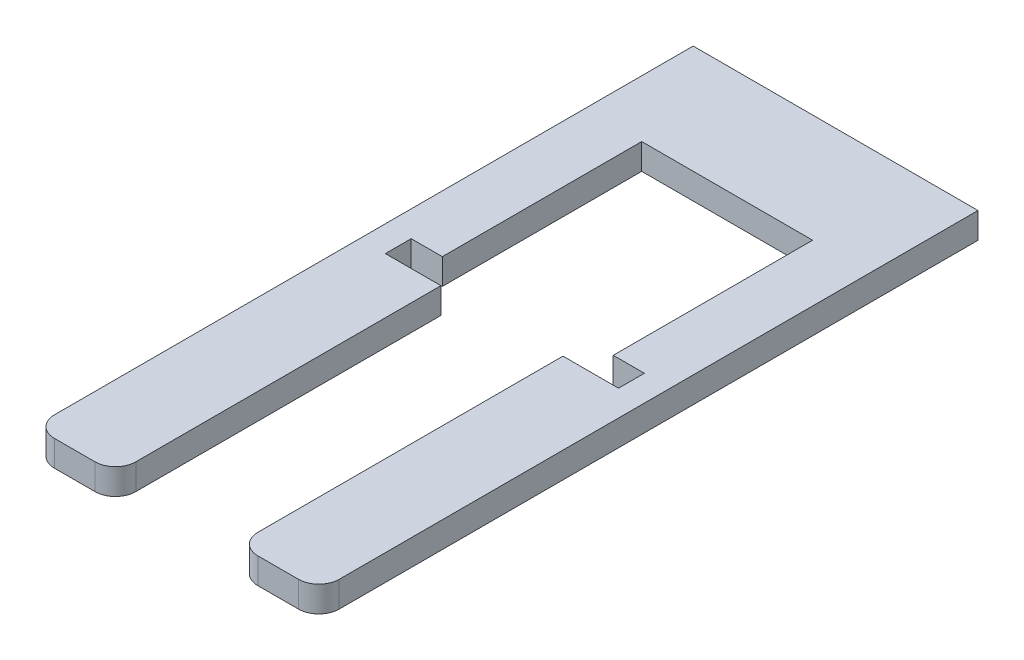
ISO-10303-21;
HEADER;
FILE_DESCRIPTION(('STEP AP214'),'2;1');
FILE_NAME('part.step','',(''),(''),'','','');
FILE_SCHEMA(('AUTOMOTIVE_DESIGN { 1 0 10303 214 1 1 1 1 }'));
ENDSEC;
DATA;
#1=APPLICATION_CONTEXT('core data for automotive mechanical design processes');
#2=APPLICATION_PROTOCOL_DEFINITION('international standard','automotive_design',2000,#1);
#3=PRODUCT_CONTEXT('',#1,'mechanical');
#4=PRODUCT('Part','Part','',(#3));
#5=PRODUCT_RELATED_PRODUCT_CATEGORY('part','',(#4));
#6=PRODUCT_DEFINITION_FORMATION('','',#4);
#7=PRODUCT_DEFINITION_CONTEXT('part definition',#1,'design');
#8=PRODUCT_DEFINITION('design','',#6,#7);
#9=PRODUCT_DEFINITION_SHAPE('','',#8);
#10=(LENGTH_UNIT() NAMED_UNIT(*) SI_UNIT(.MILLI.,.METRE.));
#11=(NAMED_UNIT(*) PLANE_ANGLE_UNIT() SI_UNIT($,.RADIAN.));
#12=(NAMED_UNIT(*) SI_UNIT($,.STERADIAN.) SOLID_ANGLE_UNIT());
#13=UNCERTAINTY_MEASURE_WITH_UNIT(LENGTH_MEASURE(1.E-05),#10,'distance_accuracy_value','');
#14=(GEOMETRIC_REPRESENTATION_CONTEXT(3) GLOBAL_UNCERTAINTY_ASSIGNED_CONTEXT((#13)) GLOBAL_UNIT_ASSIGNED_CONTEXT((#10,
#11,#12)) REPRESENTATION_CONTEXT('',''));
#15=CARTESIAN_POINT('',(0.,0.,0.));
#16=DIRECTION('',(0.,0.,1.));
#17=DIRECTION('',(1.,0.,0.));
#18=AXIS2_PLACEMENT_3D('',#15,#16,#17);
#19=CARTESIAN_POINT('',(0.,3.175,200.));
#20=DIRECTION('',(0.,0.,-1.));
#21=DIRECTION('',(-1.,0.,0.));
#22=AXIS2_PLACEMENT_3D('',#19,#20,#21);
#23=PLANE('',#22);
#24=DIRECTION('',(1.,0.,0.));
#25=VECTOR('',#24,1.);
#26=CARTESIAN_POINT('',(0.,-3.175,200.));
#27=LINE('',#26,#25);
#28=CARTESIAN_POINT('',(-30.,-3.175,200.));
#29=VERTEX_POINT('',#28);
#30=CARTESIAN_POINT('',(-20.,-3.175,200.));
#31=VERTEX_POINT('',#30);
#32=EDGE_CURVE('E287',#29,#31,#27,.T.);
#33=ORIENTED_EDGE('',*,*,#32,.T.);
#34=DIRECTION('',(0.,1.,0.));
#35=VECTOR('',#34,1.);
#36=CARTESIAN_POINT('',(-20.,3.175,200.));
#37=LINE('',#36,#35);
#38=CARTESIAN_POINT('',(-20.,3.175,200.));
#39=VERTEX_POINT('',#38);
#40=EDGE_CURVE('E314',#31,#39,#37,.T.);
#41=ORIENTED_EDGE('',*,*,#40,.T.);
#42=DIRECTION('',(1.,0.,0.));
#43=VECTOR('',#42,1.);
#44=CARTESIAN_POINT('',(0.,3.175,200.));
#45=LINE('',#44,#43);
#46=CARTESIAN_POINT('',(-30.,3.175,200.));
#47=VERTEX_POINT('',#46);
#48=EDGE_CURVE('E279',#47,#39,#45,.T.);
#49=ORIENTED_EDGE('',*,*,#48,.F.);
#50=DIRECTION('',(0.,-1.,0.));
#51=VECTOR('',#50,1.);
#52=CARTESIAN_POINT('',(-30.,3.175,200.));
#53=LINE('',#52,#51);
#54=EDGE_CURVE('E311',#47,#29,#53,.T.);
#55=ORIENTED_EDGE('',*,*,#54,.T.);
#56=EDGE_LOOP('',(#33,#41,#49,#55));
#57=FACE_BOUND('',#56,.T.);
#58=ADVANCED_FACE('F37',(#57),#23,.F.);
#59=CARTESIAN_POINT('',(-35.,3.175,0.));
#60=DIRECTION('',(1.,0.,0.));
#61=DIRECTION('',(0.,0.,-1.));
#62=AXIS2_PLACEMENT_3D('',#59,#60,#61);
#63=PLANE('',#62);
#64=DIRECTION('',(0.,0.,1.));
#65=VECTOR('',#64,1.);
#66=CARTESIAN_POINT('',(-35.,-3.175,0.));
#67=LINE('',#66,#65);
#68=CARTESIAN_POINT('',(-35.,-3.175,38.));
#69=VERTEX_POINT('',#68);
#70=CARTESIAN_POINT('',(-35.,-3.175,195.));
#71=VERTEX_POINT('',#70);
#72=EDGE_CURVE('E271',#69,#71,#67,.T.);
#73=ORIENTED_EDGE('',*,*,#72,.T.);
#74=DIRECTION('',(0.,-1.,0.));
#75=VECTOR('',#74,1.);
#76=CARTESIAN_POINT('',(-35.,3.175,195.));
#77=LINE('',#76,#75);
#78=CARTESIAN_POINT('',(-35.,3.175,195.));
#79=VERTEX_POINT('',#78);
#80=EDGE_CURVE('E11',#71,#79,#77,.F.);
#81=ORIENTED_EDGE('',*,*,#80,.T.);
#82=DIRECTION('',(0.,0.,1.));
#83=VECTOR('',#82,1.);
#84=CARTESIAN_POINT('',(-35.,3.175,0.));
#85=LINE('',#84,#83);
#86=CARTESIAN_POINT('',(-35.,3.175,38.));
#87=VERTEX_POINT('',#86);
#88=EDGE_CURVE('E274',#87,#79,#85,.T.);
#89=ORIENTED_EDGE('',*,*,#88,.F.);
#90=DIRECTION('',(0.,1.,0.));
#91=VECTOR('',#90,1.);
#92=CARTESIAN_POINT('',(-35.,-3.175,38.));
#93=LINE('',#92,#91);
#94=EDGE_CURVE('E269',#69,#87,#93,.T.);
#95=ORIENTED_EDGE('',*,*,#94,.F.);
#96=EDGE_LOOP('',(#73,#81,#89,#95));
#97=FACE_BOUND('',#96,.T.);
#98=ADVANCED_FACE('F332',(#97),#63,.F.);
#99=CARTESIAN_POINT('',(35.,3.175,0.));
#100=DIRECTION('',(-1.,0.,0.));
#101=DIRECTION('',(0.,0.,1.));
#102=AXIS2_PLACEMENT_3D('',#99,#100,#101);
#103=PLANE('',#102);
#104=DIRECTION('',(0.,0.,-1.));
#105=VECTOR('',#104,1.);
#106=CARTESIAN_POINT('',(35.,3.175,0.));
#107=LINE('',#106,#105);
#108=CARTESIAN_POINT('',(35.,3.175,195.));
#109=VERTEX_POINT('',#108);
#110=CARTESIAN_POINT('',(35.,3.175,38.));
#111=VERTEX_POINT('',#110);
#112=EDGE_CURVE('E282',#109,#111,#107,.T.);
#113=ORIENTED_EDGE('',*,*,#112,.F.);
#114=DIRECTION('',(0.,-1.,0.));
#115=VECTOR('',#114,1.);
#116=CARTESIAN_POINT('',(35.,3.175,195.));
#117=LINE('',#116,#115);
#118=CARTESIAN_POINT('',(35.,-3.175,195.));
#119=VERTEX_POINT('',#118);
#120=EDGE_CURVE('E45',#109,#119,#117,.T.);
#121=ORIENTED_EDGE('',*,*,#120,.T.);
#122=DIRECTION('',(0.,0.,-1.));
#123=VECTOR('',#122,1.);
#124=CARTESIAN_POINT('',(35.,-3.175,0.));
#125=LINE('',#124,#123);
#126=CARTESIAN_POINT('',(35.,-3.175,38.));
#127=VERTEX_POINT('',#126);
#128=EDGE_CURVE('E278',#119,#127,#125,.T.);
#129=ORIENTED_EDGE('',*,*,#128,.T.);
#130=DIRECTION('',(0.,1.,0.));
#131=VECTOR('',#130,1.);
#132=CARTESIAN_POINT('',(35.,-3.175,38.));
#133=LINE('',#132,#131);
#134=EDGE_CURVE('E266',#127,#111,#133,.T.);
#135=ORIENTED_EDGE('',*,*,#134,.T.);
#136=EDGE_LOOP('',(#113,#121,#129,#135));
#137=FACE_BOUND('',#136,.T.);
#138=ADVANCED_FACE('F321',(#137),#103,.F.);
#139=CARTESIAN_POINT('',(0.,3.175,0.));
#140=DIRECTION('',(0.,1.,0.));
#141=DIRECTION('',(0.,0.,1.));
#142=AXIS2_PLACEMENT_3D('',#139,#140,#141);
#143=PLANE('',#142);
#144=DIRECTION('',(0.,0.,-1.));
#145=VECTOR('',#144,1.);
#146=CARTESIAN_POINT('',(15.,3.175,0.));
#147=LINE('',#146,#145);
#148=CARTESIAN_POINT('',(15.,3.175,195.));
#149=VERTEX_POINT('',#148);
#150=CARTESIAN_POINT('',(15.,3.175,120.));
#151=VERTEX_POINT('',#150);
#152=EDGE_CURVE('E234',#149,#151,#147,.T.);
#153=ORIENTED_EDGE('',*,*,#152,.F.);
#154=CARTESIAN_POINT('',(20.,3.175,195.));
#155=DIRECTION('',(0.,1.,0.));
#156=DIRECTION('',(0.,0.,1.));
#157=AXIS2_PLACEMENT_3D('',#154,#155,#156);
#158=CIRCLE('',#157,5.);
#159=CARTESIAN_POINT('',(20.,3.175,200.));
#160=VERTEX_POINT('',#159);
#161=EDGE_CURVE('E299',#149,#160,#158,.T.);
#162=ORIENTED_EDGE('',*,*,#161,.T.);
#163=CARTESIAN_POINT('',(30.,3.175,200.));
#164=VERTEX_POINT('',#163);
#165=EDGE_CURVE('E277',#160,#164,#45,.T.);
#166=ORIENTED_EDGE('',*,*,#165,.T.);
#167=CARTESIAN_POINT('',(30.,3.175,195.));
#168=DIRECTION('',(0.,1.,0.));
#169=DIRECTION('',(0.,0.,1.));
#170=AXIS2_PLACEMENT_3D('',#167,#168,#169);
#171=CIRCLE('',#170,5.);
#172=EDGE_CURVE('E295',#164,#109,#171,.T.);
#173=ORIENTED_EDGE('',*,*,#172,.T.);
#174=ORIENTED_EDGE('',*,*,#112,.T.);
#175=DIRECTION('',(-1.,0.,0.));
#176=VECTOR('',#175,1.);
#177=CARTESIAN_POINT('',(0.,3.175,38.));
#178=LINE('',#177,#176);
#179=EDGE_CURVE('E246',#111,#87,#178,.T.);
#180=ORIENTED_EDGE('',*,*,#179,.T.);
#181=ORIENTED_EDGE('',*,*,#88,.T.);
#182=CARTESIAN_POINT('',(-30.,3.175,195.));
#183=DIRECTION('',(0.,1.,0.));
#184=DIRECTION('',(0.,0.,1.));
#185=AXIS2_PLACEMENT_3D('',#182,#183,#184);
#186=CIRCLE('',#185,5.);
#187=EDGE_CURVE('E293',#79,#47,#186,.T.);
#188=ORIENTED_EDGE('',*,*,#187,.T.);
#189=ORIENTED_EDGE('',*,*,#48,.T.);
#190=CARTESIAN_POINT('',(-20.,3.175,195.));
#191=DIRECTION('',(0.,1.,0.));
#192=DIRECTION('',(0.,0.,1.));
#193=AXIS2_PLACEMENT_3D('',#190,#191,#192);
#194=CIRCLE('',#193,5.);
#195=CARTESIAN_POINT('',(-15.,3.175,195.));
#196=VERTEX_POINT('',#195);
#197=EDGE_CURVE('E297',#39,#196,#194,.T.);
#198=ORIENTED_EDGE('',*,*,#197,.T.);
#199=DIRECTION('',(0.,0.,-1.));
#200=VECTOR('',#199,1.);
#201=CARTESIAN_POINT('',(-15.,3.175,0.));
#202=LINE('',#201,#200);
#203=CARTESIAN_POINT('',(-15.,3.175,120.));
#204=VERTEX_POINT('',#203);
#205=EDGE_CURVE('E231',#196,#204,#202,.T.);
#206=ORIENTED_EDGE('',*,*,#205,.T.);
#207=DIRECTION('',(-1.,0.,0.));
#208=VECTOR('',#207,1.);
#209=CARTESIAN_POINT('',(0.,3.175,120.));
#210=LINE('',#209,#208);
#211=CARTESIAN_POINT('',(-28.65,3.175,120.));
#212=VERTEX_POINT('',#211);
#213=EDGE_CURVE('E228',#204,#212,#210,.T.);
#214=ORIENTED_EDGE('',*,*,#213,.T.);
#215=DIRECTION('',(0.,0.,-1.));
#216=VECTOR('',#215,1.);
#217=CARTESIAN_POINT('',(-28.65,3.175,0.));
#218=LINE('',#217,#216);
#219=CARTESIAN_POINT('',(-28.65,3.175,113.65));
#220=VERTEX_POINT('',#219);
#221=EDGE_CURVE('E225',#212,#220,#218,.T.);
#222=ORIENTED_EDGE('',*,*,#221,.T.);
#223=DIRECTION('',(-1.,0.,0.));
#224=VECTOR('',#223,1.);
#225=CARTESIAN_POINT('',(0.,3.175,113.65));
#226=LINE('',#225,#224);
#227=CARTESIAN_POINT('',(-21.,3.175,113.65));
#228=VERTEX_POINT('',#227);
#229=EDGE_CURVE('E223',#228,#220,#226,.T.);
#230=ORIENTED_EDGE('',*,*,#229,.F.);
#231=DIRECTION('',(0.,0.,-1.));
#232=VECTOR('',#231,1.);
#233=CARTESIAN_POINT('',(-21.,3.175,0.));
#234=LINE('',#233,#232);
#235=CARTESIAN_POINT('',(-21.,3.175,64.65));
#236=VERTEX_POINT('',#235);
#237=EDGE_CURVE('E181',#228,#236,#234,.T.);
#238=ORIENTED_EDGE('',*,*,#237,.T.);
#239=DIRECTION('',(-1.,0.,0.));
#240=VECTOR('',#239,1.);
#241=CARTESIAN_POINT('',(0.,3.175,64.65));
#242=LINE('',#241,#240);
#243=CARTESIAN_POINT('',(21.,3.175,64.65));
#244=VERTEX_POINT('',#243);
#245=EDGE_CURVE('E200',#244,#236,#242,.T.);
#246=ORIENTED_EDGE('',*,*,#245,.F.);
#247=DIRECTION('',(0.,0.,-1.));
#248=VECTOR('',#247,1.);
#249=CARTESIAN_POINT('',(21.,3.175,0.));
#250=LINE('',#249,#248);
#251=CARTESIAN_POINT('',(21.,3.175,113.65));
#252=VERTEX_POINT('',#251);
#253=EDGE_CURVE('E203',#252,#244,#250,.T.);
#254=ORIENTED_EDGE('',*,*,#253,.F.);
#255=DIRECTION('',(1.,0.,0.));
#256=VECTOR('',#255,1.);
#257=CARTESIAN_POINT('',(0.,3.175,113.65));
#258=LINE('',#257,#256);
#259=CARTESIAN_POINT('',(28.65,3.175,113.65));
#260=VERTEX_POINT('',#259);
#261=EDGE_CURVE('E239',#252,#260,#258,.T.);
#262=ORIENTED_EDGE('',*,*,#261,.T.);
#263=DIRECTION('',(0.,0.,-1.));
#264=VECTOR('',#263,1.);
#265=CARTESIAN_POINT('',(28.65,3.175,0.));
#266=LINE('',#265,#264);
#267=CARTESIAN_POINT('',(28.65,3.175,120.));
#268=VERTEX_POINT('',#267);
#269=EDGE_CURVE('E236',#268,#260,#266,.T.);
#270=ORIENTED_EDGE('',*,*,#269,.F.);
#271=EDGE_CURVE('E232',#268,#151,#210,.T.);
#272=ORIENTED_EDGE('',*,*,#271,.T.);
#273=EDGE_LOOP('',(#153,#162,#166,#173,#174,#180,#181,#188,#189,#198,#206,#214,#222,#230,#238,
#246,#254,#262,#270,#272));
#274=FACE_BOUND('',#273,.T.);
#275=ADVANCED_FACE('F337',(#274),#143,.T.);
#276=CARTESIAN_POINT('',(0.,-3.175,0.));
#277=DIRECTION('',(0.,1.,0.));
#278=DIRECTION('',(0.,0.,1.));
#279=AXIS2_PLACEMENT_3D('',#276,#277,#278);
#280=PLANE('',#279);
#281=CARTESIAN_POINT('',(20.,-3.175,200.));
#282=VERTEX_POINT('',#281);
#283=CARTESIAN_POINT('',(30.,-3.175,200.));
#284=VERTEX_POINT('',#283);
#285=EDGE_CURVE('E286',#282,#284,#27,.T.);
#286=ORIENTED_EDGE('',*,*,#285,.F.);
#287=CARTESIAN_POINT('',(20.,-3.175,195.));
#288=DIRECTION('',(0.,1.,0.));
#289=DIRECTION('',(0.,0.,1.));
#290=AXIS2_PLACEMENT_3D('',#287,#288,#289);
#291=CIRCLE('',#290,5.);
#292=CARTESIAN_POINT('',(15.,-3.175,195.));
#293=VERTEX_POINT('',#292);
#294=EDGE_CURVE('E309',#282,#293,#291,.F.);
#295=ORIENTED_EDGE('',*,*,#294,.T.);
#296=DIRECTION('',(0.,0.,-1.));
#297=VECTOR('',#296,1.);
#298=CARTESIAN_POINT('',(15.,-3.175,0.));
#299=LINE('',#298,#297);
#300=CARTESIAN_POINT('',(15.,-3.175,120.));
#301=VERTEX_POINT('',#300);
#302=EDGE_CURVE('E212',#293,#301,#299,.T.);
#303=ORIENTED_EDGE('',*,*,#302,.T.);
#304=DIRECTION('',(-1.,0.,0.));
#305=VECTOR('',#304,1.);
#306=CARTESIAN_POINT('',(0.,-3.175,120.));
#307=LINE('',#306,#305);
#308=CARTESIAN_POINT('',(28.65,-3.175,120.));
#309=VERTEX_POINT('',#308);
#310=EDGE_CURVE('E210',#309,#301,#307,.T.);
#311=ORIENTED_EDGE('',*,*,#310,.F.);
#312=DIRECTION('',(0.,0.,-1.));
#313=VECTOR('',#312,1.);
#314=CARTESIAN_POINT('',(28.65,-3.175,0.));
#315=LINE('',#314,#313);
#316=CARTESIAN_POINT('',(28.65,-3.175,113.65));
#317=VERTEX_POINT('',#316);
#318=EDGE_CURVE('E214',#309,#317,#315,.T.);
#319=ORIENTED_EDGE('',*,*,#318,.T.);
#320=DIRECTION('',(1.,0.,0.));
#321=VECTOR('',#320,1.);
#322=CARTESIAN_POINT('',(0.,-3.175,113.65));
#323=LINE('',#322,#321);
#324=CARTESIAN_POINT('',(21.,-3.175,113.65));
#325=VERTEX_POINT('',#324);
#326=EDGE_CURVE('E217',#325,#317,#323,.T.);
#327=ORIENTED_EDGE('',*,*,#326,.F.);
#328=DIRECTION('',(0.,0.,-1.));
#329=VECTOR('',#328,1.);
#330=CARTESIAN_POINT('',(21.,-3.175,0.));
#331=LINE('',#330,#329);
#332=CARTESIAN_POINT('',(21.,-3.175,64.65));
#333=VERTEX_POINT('',#332);
#334=EDGE_CURVE('E219',#325,#333,#331,.T.);
#335=ORIENTED_EDGE('',*,*,#334,.T.);
#336=DIRECTION('',(-1.,0.,0.));
#337=VECTOR('',#336,1.);
#338=CARTESIAN_POINT('',(0.,-3.175,64.65));
#339=LINE('',#338,#337);
#340=CARTESIAN_POINT('',(-21.,-3.175,64.65));
#341=VERTEX_POINT('',#340);
#342=EDGE_CURVE('E186',#333,#341,#339,.T.);
#343=ORIENTED_EDGE('',*,*,#342,.T.);
#344=DIRECTION('',(0.,0.,-1.));
#345=VECTOR('',#344,1.);
#346=CARTESIAN_POINT('',(-21.,-3.175,0.));
#347=LINE('',#346,#345);
#348=CARTESIAN_POINT('',(-21.,-3.175,113.65));
#349=VERTEX_POINT('',#348);
#350=EDGE_CURVE('E178',#349,#341,#347,.T.);
#351=ORIENTED_EDGE('',*,*,#350,.F.);
#352=DIRECTION('',(-1.,0.,0.));
#353=VECTOR('',#352,1.);
#354=CARTESIAN_POINT('',(0.,-3.175,113.65));
#355=LINE('',#354,#353);
#356=CARTESIAN_POINT('',(-28.65,-3.175,113.65));
#357=VERTEX_POINT('',#356);
#358=EDGE_CURVE('E190',#349,#357,#355,.T.);
#359=ORIENTED_EDGE('',*,*,#358,.T.);
#360=DIRECTION('',(0.,0.,-1.));
#361=VECTOR('',#360,1.);
#362=CARTESIAN_POINT('',(-28.65,-3.175,0.));
#363=LINE('',#362,#361);
#364=CARTESIAN_POINT('',(-28.65,-3.175,120.));
#365=VERTEX_POINT('',#364);
#366=EDGE_CURVE('E193',#365,#357,#363,.T.);
#367=ORIENTED_EDGE('',*,*,#366,.F.);
#368=CARTESIAN_POINT('',(-15.,-3.175,120.));
#369=VERTEX_POINT('',#368);
#370=EDGE_CURVE('E207',#369,#365,#307,.T.);
#371=ORIENTED_EDGE('',*,*,#370,.F.);
#372=DIRECTION('',(0.,0.,-1.));
#373=VECTOR('',#372,1.);
#374=CARTESIAN_POINT('',(-15.,-3.175,0.));
#375=LINE('',#374,#373);
#376=CARTESIAN_POINT('',(-15.,-3.175,195.));
#377=VERTEX_POINT('',#376);
#378=EDGE_CURVE('E209',#377,#369,#375,.T.);
#379=ORIENTED_EDGE('',*,*,#378,.F.);
#380=CARTESIAN_POINT('',(-20.,-3.175,195.));
#381=DIRECTION('',(0.,1.,0.));
#382=DIRECTION('',(0.,0.,1.));
#383=AXIS2_PLACEMENT_3D('',#380,#381,#382);
#384=CIRCLE('',#383,5.);
#385=EDGE_CURVE('E307',#377,#31,#384,.F.);
#386=ORIENTED_EDGE('',*,*,#385,.T.);
#387=ORIENTED_EDGE('',*,*,#32,.F.);
#388=CARTESIAN_POINT('',(-30.,-3.175,195.));
#389=DIRECTION('',(0.,1.,0.));
#390=DIRECTION('',(0.,0.,1.));
#391=AXIS2_PLACEMENT_3D('',#388,#389,#390);
#392=CIRCLE('',#391,5.);
#393=EDGE_CURVE('E60',#29,#71,#392,.F.);
#394=ORIENTED_EDGE('',*,*,#393,.T.);
#395=ORIENTED_EDGE('',*,*,#72,.F.);
#396=DIRECTION('',(-1.,0.,0.));
#397=VECTOR('',#396,1.);
#398=CARTESIAN_POINT('',(0.,-3.175,38.));
#399=LINE('',#398,#397);
#400=EDGE_CURVE('E264',#127,#69,#399,.T.);
#401=ORIENTED_EDGE('',*,*,#400,.F.);
#402=ORIENTED_EDGE('',*,*,#128,.F.);
#403=CARTESIAN_POINT('',(30.,-3.175,195.));
#404=DIRECTION('',(0.,1.,0.));
#405=DIRECTION('',(0.,0.,1.));
#406=AXIS2_PLACEMENT_3D('',#403,#404,#405);
#407=CIRCLE('',#406,5.);
#408=EDGE_CURVE('E52',#119,#284,#407,.F.);
#409=ORIENTED_EDGE('',*,*,#408,.T.);
#410=EDGE_LOOP('',(#286,#295,#303,#311,#319,#327,#335,#343,#351,#359,#367,#371,#379,#386,#387,
#394,#395,#401,#402,#409));
#411=FACE_BOUND('',#410,.T.);
#412=ADVANCED_FACE('F197',(#411),#280,.F.);
#413=ORIENTED_EDGE('',*,*,#165,.F.);
#414=DIRECTION('',(0.,1.,0.));
#415=VECTOR('',#414,1.);
#416=CARTESIAN_POINT('',(20.,3.175,200.));
#417=LINE('',#416,#415);
#418=EDGE_CURVE('E303',#160,#282,#417,.F.);
#419=ORIENTED_EDGE('',*,*,#418,.T.);
#420=ORIENTED_EDGE('',*,*,#285,.T.);
#421=DIRECTION('',(0.,-1.,0.));
#422=VECTOR('',#421,1.);
#423=CARTESIAN_POINT('',(30.,3.175,200.));
#424=LINE('',#423,#422);
#425=EDGE_CURVE('E301',#284,#164,#424,.F.);
#426=ORIENTED_EDGE('',*,*,#425,.T.);
#427=EDGE_LOOP('',(#413,#419,#420,#426));
#428=FACE_BOUND('',#427,.T.);
#429=ADVANCED_FACE('F373',(#428),#23,.F.);
#430=CARTESIAN_POINT('',(0.,-3.175,38.));
#431=DIRECTION('',(0.,0.,-1.));
#432=DIRECTION('',(-1.,0.,0.));
#433=AXIS2_PLACEMENT_3D('',#430,#431,#432);
#434=PLANE('',#433);
#435=ORIENTED_EDGE('',*,*,#179,.F.);
#436=ORIENTED_EDGE('',*,*,#134,.F.);
#437=ORIENTED_EDGE('',*,*,#400,.T.);
#438=ORIENTED_EDGE('',*,*,#94,.T.);
#439=EDGE_LOOP('',(#435,#436,#437,#438));
#440=FACE_BOUND('',#439,.T.);
#441=ADVANCED_FACE('F329',(#440),#434,.T.);
#442=CARTESIAN_POINT('',(-21.,-3.175,0.));
#443=DIRECTION('',(1.,0.,0.));
#444=DIRECTION('',(0.,0.,-1.));
#445=AXIS2_PLACEMENT_3D('',#442,#443,#444);
#446=PLANE('',#445);
#447=ORIENTED_EDGE('',*,*,#237,.F.);
#448=DIRECTION('',(0.,1.,0.));
#449=VECTOR('',#448,1.);
#450=CARTESIAN_POINT('',(-21.,-3.175,113.65));
#451=LINE('',#450,#449);
#452=EDGE_CURVE('E174',#349,#228,#451,.T.);
#453=ORIENTED_EDGE('',*,*,#452,.F.);
#454=ORIENTED_EDGE('',*,*,#350,.T.);
#455=DIRECTION('',(0.,1.,0.));
#456=VECTOR('',#455,1.);
#457=CARTESIAN_POINT('',(-21.,-3.175,64.65));
#458=LINE('',#457,#456);
#459=EDGE_CURVE('E244',#341,#236,#458,.T.);
#460=ORIENTED_EDGE('',*,*,#459,.T.);
#461=EDGE_LOOP('',(#447,#453,#454,#460));
#462=FACE_BOUND('',#461,.T.);
#463=ADVANCED_FACE('F176',(#462),#446,.T.);
#464=CARTESIAN_POINT('',(0.,-3.175,64.65));
#465=DIRECTION('',(0.,0.,-1.));
#466=DIRECTION('',(-1.,0.,0.));
#467=AXIS2_PLACEMENT_3D('',#464,#465,#466);
#468=PLANE('',#467);
#469=ORIENTED_EDGE('',*,*,#245,.T.);
#470=ORIENTED_EDGE('',*,*,#459,.F.);
#471=ORIENTED_EDGE('',*,*,#342,.F.);
#472=DIRECTION('',(0.,1.,0.));
#473=VECTOR('',#472,1.);
#474=CARTESIAN_POINT('',(21.,-3.175,64.65));
#475=LINE('',#474,#473);
#476=EDGE_CURVE('E247',#333,#244,#475,.T.);
#477=ORIENTED_EDGE('',*,*,#476,.T.);
#478=EDGE_LOOP('',(#469,#470,#471,#477));
#479=FACE_BOUND('',#478,.T.);
#480=ADVANCED_FACE('F417',(#479),#468,.F.);
#481=CARTESIAN_POINT('',(21.,-3.175,0.));
#482=DIRECTION('',(1.,0.,0.));
#483=DIRECTION('',(0.,0.,-1.));
#484=AXIS2_PLACEMENT_3D('',#481,#482,#483);
#485=PLANE('',#484);
#486=ORIENTED_EDGE('',*,*,#253,.T.);
#487=ORIENTED_EDGE('',*,*,#476,.F.);
#488=ORIENTED_EDGE('',*,*,#334,.F.);
#489=DIRECTION('',(0.,1.,0.));
#490=VECTOR('',#489,1.);
#491=CARTESIAN_POINT('',(21.,-3.175,113.65));
#492=LINE('',#491,#490);
#493=EDGE_CURVE('E249',#325,#252,#492,.T.);
#494=ORIENTED_EDGE('',*,*,#493,.T.);
#495=EDGE_LOOP('',(#486,#487,#488,#494));
#496=FACE_BOUND('',#495,.T.);
#497=ADVANCED_FACE('F414',(#496),#485,.F.);
#498=CARTESIAN_POINT('',(0.,-3.175,113.65));
#499=DIRECTION('',(0.,0.,1.));
#500=DIRECTION('',(1.,0.,0.));
#501=AXIS2_PLACEMENT_3D('',#498,#499,#500);
#502=PLANE('',#501);
#503=ORIENTED_EDGE('',*,*,#261,.F.);
#504=ORIENTED_EDGE('',*,*,#493,.F.);
#505=ORIENTED_EDGE('',*,*,#326,.T.);
#506=DIRECTION('',(0.,1.,0.));
#507=VECTOR('',#506,1.);
#508=CARTESIAN_POINT('',(28.65,-3.175,113.65));
#509=LINE('',#508,#507);
#510=EDGE_CURVE('E251',#317,#260,#509,.T.);
#511=ORIENTED_EDGE('',*,*,#510,.T.);
#512=EDGE_LOOP('',(#503,#504,#505,#511));
#513=FACE_BOUND('',#512,.T.);
#514=ADVANCED_FACE('F412',(#513),#502,.T.);
#515=CARTESIAN_POINT('',(28.65,-3.175,0.));
#516=DIRECTION('',(1.,0.,0.));
#517=DIRECTION('',(0.,0.,-1.));
#518=AXIS2_PLACEMENT_3D('',#515,#516,#517);
#519=PLANE('',#518);
#520=ORIENTED_EDGE('',*,*,#269,.T.);
#521=ORIENTED_EDGE('',*,*,#510,.F.);
#522=ORIENTED_EDGE('',*,*,#318,.F.);
#523=DIRECTION('',(0.,1.,0.));
#524=VECTOR('',#523,1.);
#525=CARTESIAN_POINT('',(28.65,-3.175,120.));
#526=LINE('',#525,#524);
#527=EDGE_CURVE('E253',#309,#268,#526,.T.);
#528=ORIENTED_EDGE('',*,*,#527,.T.);
#529=EDGE_LOOP('',(#520,#521,#522,#528));
#530=FACE_BOUND('',#529,.T.);
#531=ADVANCED_FACE('F407',(#530),#519,.F.);
#532=CARTESIAN_POINT('',(0.,-3.175,120.));
#533=DIRECTION('',(0.,0.,-1.));
#534=DIRECTION('',(-1.,0.,0.));
#535=AXIS2_PLACEMENT_3D('',#532,#533,#534);
#536=PLANE('',#535);
#537=ORIENTED_EDGE('',*,*,#271,.F.);
#538=ORIENTED_EDGE('',*,*,#527,.F.);
#539=ORIENTED_EDGE('',*,*,#310,.T.);
#540=DIRECTION('',(0.,1.,0.));
#541=VECTOR('',#540,1.);
#542=CARTESIAN_POINT('',(15.,-3.175,120.));
#543=LINE('',#542,#541);
#544=EDGE_CURVE('E255',#301,#151,#543,.T.);
#545=ORIENTED_EDGE('',*,*,#544,.T.);
#546=EDGE_LOOP('',(#537,#538,#539,#545));
#547=FACE_BOUND('',#546,.T.);
#548=ADVANCED_FACE('F369',(#547),#536,.T.);
#549=CARTESIAN_POINT('',(15.,-3.175,0.));
#550=DIRECTION('',(1.,0.,0.));
#551=DIRECTION('',(0.,0.,-1.));
#552=AXIS2_PLACEMENT_3D('',#549,#550,#551);
#553=PLANE('',#552);
#554=ORIENTED_EDGE('',*,*,#302,.F.);
#555=DIRECTION('',(0.,1.,0.));
#556=VECTOR('',#555,1.);
#557=CARTESIAN_POINT('',(15.,-3.175,195.));
#558=LINE('',#557,#556);
#559=EDGE_CURVE('E284',#293,#149,#558,.T.);
#560=ORIENTED_EDGE('',*,*,#559,.T.);
#561=ORIENTED_EDGE('',*,*,#152,.T.);
#562=ORIENTED_EDGE('',*,*,#544,.F.);
#563=EDGE_LOOP('',(#554,#560,#561,#562));
#564=FACE_BOUND('',#563,.T.);
#565=ADVANCED_FACE('F398',(#564),#553,.F.);
#566=CARTESIAN_POINT('',(-15.,-3.175,0.));
#567=DIRECTION('',(1.,0.,0.));
#568=DIRECTION('',(0.,0.,-1.));
#569=AXIS2_PLACEMENT_3D('',#566,#567,#568);
#570=PLANE('',#569);
#571=ORIENTED_EDGE('',*,*,#205,.F.);
#572=DIRECTION('',(0.,1.,0.));
#573=VECTOR('',#572,1.);
#574=CARTESIAN_POINT('',(-15.,-3.175,195.));
#575=LINE('',#574,#573);
#576=EDGE_CURVE('E317',#196,#377,#575,.F.);
#577=ORIENTED_EDGE('',*,*,#576,.T.);
#578=ORIENTED_EDGE('',*,*,#378,.T.);
#579=DIRECTION('',(0.,1.,0.));
#580=VECTOR('',#579,1.);
#581=CARTESIAN_POINT('',(-15.,-3.175,120.));
#582=LINE('',#581,#580);
#583=EDGE_CURVE('E258',#369,#204,#582,.T.);
#584=ORIENTED_EDGE('',*,*,#583,.T.);
#585=EDGE_LOOP('',(#571,#577,#578,#584));
#586=FACE_BOUND('',#585,.T.);
#587=ADVANCED_FACE('F351',(#586),#570,.T.);
#588=ORIENTED_EDGE('',*,*,#213,.F.);
#589=ORIENTED_EDGE('',*,*,#583,.F.);
#590=ORIENTED_EDGE('',*,*,#370,.T.);
#591=DIRECTION('',(0.,1.,0.));
#592=VECTOR('',#591,1.);
#593=CARTESIAN_POINT('',(-28.65,-3.175,120.));
#594=LINE('',#593,#592);
#595=EDGE_CURVE('E261',#365,#212,#594,.T.);
#596=ORIENTED_EDGE('',*,*,#595,.T.);
#597=EDGE_LOOP('',(#588,#589,#590,#596));
#598=FACE_BOUND('',#597,.T.);
#599=ADVANCED_FACE('F355',(#598),#536,.T.);
#600=CARTESIAN_POINT('',(-28.65,-3.175,0.));
#601=DIRECTION('',(1.,0.,0.));
#602=DIRECTION('',(0.,0.,-1.));
#603=AXIS2_PLACEMENT_3D('',#600,#601,#602);
#604=PLANE('',#603);
#605=ORIENTED_EDGE('',*,*,#221,.F.);
#606=ORIENTED_EDGE('',*,*,#595,.F.);
#607=ORIENTED_EDGE('',*,*,#366,.T.);
#608=DIRECTION('',(0.,1.,0.));
#609=VECTOR('',#608,1.);
#610=CARTESIAN_POINT('',(-28.65,-3.175,113.65));
#611=LINE('',#610,#609);
#612=EDGE_CURVE('E185',#357,#220,#611,.T.);
#613=ORIENTED_EDGE('',*,*,#612,.T.);
#614=EDGE_LOOP('',(#605,#606,#607,#613));
#615=FACE_BOUND('',#614,.T.);
#616=ADVANCED_FACE('F359',(#615),#604,.T.);
#617=CARTESIAN_POINT('',(0.,-3.175,113.65));
#618=DIRECTION('',(0.,0.,-1.));
#619=DIRECTION('',(-1.,0.,0.));
#620=AXIS2_PLACEMENT_3D('',#617,#618,#619);
#621=PLANE('',#620);
#622=ORIENTED_EDGE('',*,*,#229,.T.);
#623=ORIENTED_EDGE('',*,*,#612,.F.);
#624=ORIENTED_EDGE('',*,*,#358,.F.);
#625=ORIENTED_EDGE('',*,*,#452,.T.);
#626=EDGE_LOOP('',(#622,#623,#624,#625));
#627=FACE_BOUND('',#626,.T.);
#628=ADVANCED_FACE('F191',(#627),#621,.F.);
#629=CARTESIAN_POINT('',(20.,-3.175,195.));
#630=DIRECTION('',(0.,1.,0.));
#631=DIRECTION('',(0.,0.,1.));
#632=AXIS2_PLACEMENT_3D('',#629,#630,#631);
#633=CYLINDRICAL_SURFACE('',#632,5.);
#634=ORIENTED_EDGE('',*,*,#294,.F.);
#635=ORIENTED_EDGE('',*,*,#418,.F.);
#636=ORIENTED_EDGE('',*,*,#161,.F.);
#637=ORIENTED_EDGE('',*,*,#559,.F.);
#638=EDGE_LOOP('',(#634,#635,#636,#637));
#639=FACE_BOUND('',#638,.T.);
#640=ADVANCED_FACE('F366',(#639),#633,.T.);
#641=CARTESIAN_POINT('',(-20.,3.175,195.));
#642=DIRECTION('',(0.,-1.,0.));
#643=DIRECTION('',(0.,0.,-1.));
#644=AXIS2_PLACEMENT_3D('',#641,#642,#643);
#645=CYLINDRICAL_SURFACE('',#644,5.);
#646=ORIENTED_EDGE('',*,*,#385,.F.);
#647=ORIENTED_EDGE('',*,*,#576,.F.);
#648=ORIENTED_EDGE('',*,*,#197,.F.);
#649=ORIENTED_EDGE('',*,*,#40,.F.);
#650=EDGE_LOOP('',(#646,#647,#648,#649));
#651=FACE_BOUND('',#650,.T.);
#652=ADVANCED_FACE('F348',(#651),#645,.T.);
#653=CARTESIAN_POINT('',(30.,3.175,195.));
#654=DIRECTION('',(0.,-1.,0.));
#655=DIRECTION('',(0.,0.,-1.));
#656=AXIS2_PLACEMENT_3D('',#653,#654,#655);
#657=CYLINDRICAL_SURFACE('',#656,5.);
#658=ORIENTED_EDGE('',*,*,#172,.F.);
#659=ORIENTED_EDGE('',*,*,#425,.F.);
#660=ORIENTED_EDGE('',*,*,#408,.F.);
#661=ORIENTED_EDGE('',*,*,#120,.F.);
#662=EDGE_LOOP('',(#658,#659,#660,#661));
#663=FACE_BOUND('',#662,.T.);
#664=ADVANCED_FACE('F571',(#663),#657,.T.);
#665=CARTESIAN_POINT('',(-30.,3.175,195.));
#666=DIRECTION('',(0.,-1.,0.));
#667=DIRECTION('',(0.,0.,-1.));
#668=AXIS2_PLACEMENT_3D('',#665,#666,#667);
#669=CYLINDRICAL_SURFACE('',#668,5.);
#670=ORIENTED_EDGE('',*,*,#187,.F.);
#671=ORIENTED_EDGE('',*,*,#80,.F.);
#672=ORIENTED_EDGE('',*,*,#393,.F.);
#673=ORIENTED_EDGE('',*,*,#54,.F.);
#674=EDGE_LOOP('',(#670,#671,#672,#673));
#675=FACE_BOUND('',#674,.T.);
#676=ADVANCED_FACE('F39',(#675),#669,.T.);
#677=CLOSED_SHELL('',(#58,#98,#138,#275,#412,#429,#441,#463,#480,#497,#514,#531,#548,#565,#587,
#599,#616,#628,#640,#652,#664,#676));
#678=MANIFOLD_SOLID_BREP('B2',#677);
#679=ADVANCED_BREP_SHAPE_REPRESENTATION('',(#18,#678),#14);
#680=SHAPE_DEFINITION_REPRESENTATION(#9,#679);
ENDSEC;
END-ISO-10303-21;
